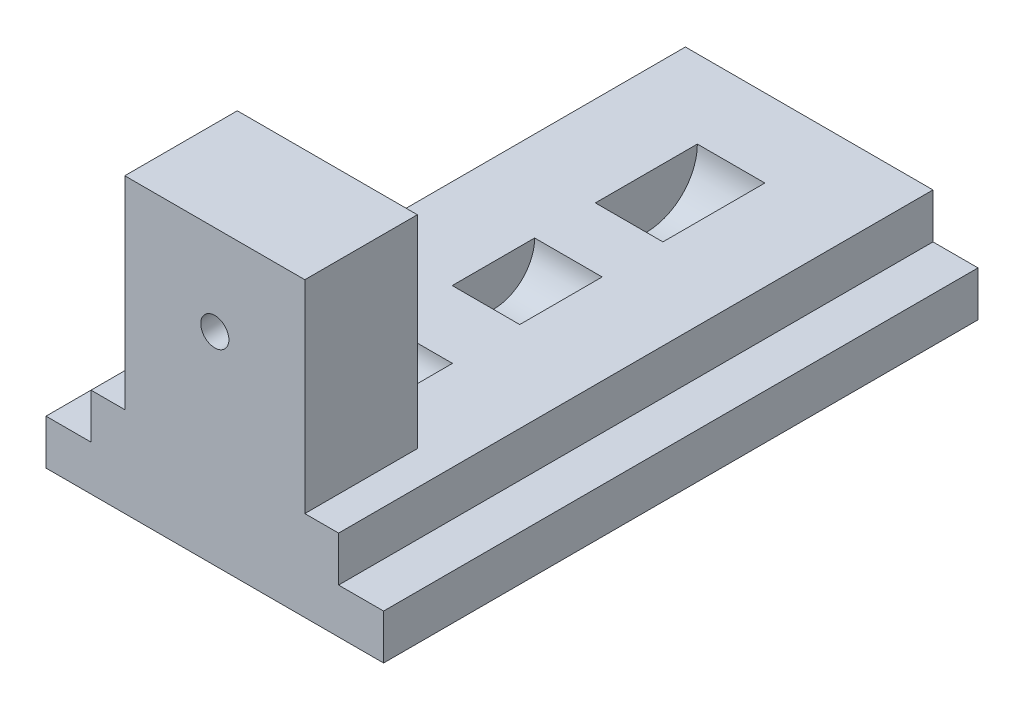
ISO-10303-21;
HEADER;
FILE_DESCRIPTION(('STEP AP214'),'2;1');
FILE_NAME('part.step','',(''),(''),'','','');
FILE_SCHEMA(('AUTOMOTIVE_DESIGN { 1 0 10303 214 1 1 1 1 }'));
ENDSEC;
DATA;
#1=APPLICATION_CONTEXT('core data for automotive mechanical design processes');
#2=APPLICATION_PROTOCOL_DEFINITION('international standard','automotive_design',2000,#1);
#3=PRODUCT_CONTEXT('',#1,'mechanical');
#4=PRODUCT('Part','Part','',(#3));
#5=PRODUCT_RELATED_PRODUCT_CATEGORY('part','',(#4));
#6=PRODUCT_DEFINITION_FORMATION('','',#4);
#7=PRODUCT_DEFINITION_CONTEXT('part definition',#1,'design');
#8=PRODUCT_DEFINITION('design','',#6,#7);
#9=PRODUCT_DEFINITION_SHAPE('','',#8);
#10=(LENGTH_UNIT() NAMED_UNIT(*) SI_UNIT(.MILLI.,.METRE.));
#11=(NAMED_UNIT(*) PLANE_ANGLE_UNIT() SI_UNIT($,.RADIAN.));
#12=(NAMED_UNIT(*) SI_UNIT($,.STERADIAN.) SOLID_ANGLE_UNIT());
#13=UNCERTAINTY_MEASURE_WITH_UNIT(LENGTH_MEASURE(1.E-05),#10,'distance_accuracy_value','');
#14=(GEOMETRIC_REPRESENTATION_CONTEXT(3) GLOBAL_UNCERTAINTY_ASSIGNED_CONTEXT((#13)) GLOBAL_UNIT_ASSIGNED_CONTEXT((#10,
#11,#12)) REPRESENTATION_CONTEXT('',''));
#15=CARTESIAN_POINT('',(0.,0.,0.));
#16=DIRECTION('',(0.,0.,1.));
#17=DIRECTION('',(1.,0.,0.));
#18=AXIS2_PLACEMENT_3D('',#15,#16,#17);
#19=CARTESIAN_POINT('',(6.,8.,-11.9518072289156));
#20=DIRECTION('',(0.,-1.,0.));
#21=DIRECTION('',(0.,0.,-1.));
#22=AXIS2_PLACEMENT_3D('',#19,#20,#21);
#23=PLANE('',#22);
#24=DIRECTION('',(-1.,0.,0.));
#25=VECTOR('',#24,1.);
#26=CARTESIAN_POINT('',(6.,7.99999999999996,-36.8192771084335));
#27=LINE('',#26,#25);
#28=CARTESIAN_POINT('',(6.,7.99999999999996,-36.8192771084335));
#29=VERTEX_POINT('',#28);
#30=CARTESIAN_POINT('',(0.,7.99999999999996,-36.8192771084335));
#31=VERTEX_POINT('',#30);
#32=EDGE_CURVE('E277',#29,#31,#27,.T.);
#33=ORIENTED_EDGE('',*,*,#32,.T.);
#34=DIRECTION('',(0.,0.,1.));
#35=VECTOR('',#34,1.);
#36=CARTESIAN_POINT('',(0.,8.,-67.2414822102894));
#37=LINE('',#36,#35);
#38=CARTESIAN_POINT('',(0.,8.,-45.8795180722889));
#39=VERTEX_POINT('',#38);
#40=EDGE_CURVE('E213',#39,#31,#37,.T.);
#41=ORIENTED_EDGE('',*,*,#40,.F.);
#42=DIRECTION('',(-1.,0.,0.));
#43=VECTOR('',#42,1.);
#44=CARTESIAN_POINT('',(6.,7.99999999999996,-45.8795180722889));
#45=LINE('',#44,#43);
#46=CARTESIAN_POINT('',(6.,7.99999999999996,-45.8795180722889));
#47=VERTEX_POINT('',#46);
#48=EDGE_CURVE('E280',#47,#39,#45,.T.);
#49=ORIENTED_EDGE('',*,*,#48,.F.);
#50=DIRECTION('',(0.,0.,1.));
#51=VECTOR('',#50,1.);
#52=CARTESIAN_POINT('',(6.,8.,-67.2414822102894));
#53=LINE('',#52,#51);
#54=EDGE_CURVE('E220',#47,#29,#53,.T.);
#55=ORIENTED_EDGE('',*,*,#54,.T.);
#56=EDGE_LOOP('',(#33,#41,#49,#55));
#57=FACE_BOUND('',#56,.T.);
#58=CARTESIAN_POINT('',(0.,8.,-31.4216867469878));
#59=VERTEX_POINT('',#58);
#60=CARTESIAN_POINT('',(0.,8.,-24.0963855421685));
#61=VERTEX_POINT('',#60);
#62=EDGE_CURVE('E215',#59,#61,#37,.T.);
#63=ORIENTED_EDGE('',*,*,#62,.F.);
#64=DIRECTION('',(-1.,0.,0.));
#65=VECTOR('',#64,1.);
#66=CARTESIAN_POINT('',(6.,7.99999999999999,-31.4216867469878));
#67=LINE('',#66,#65);
#68=CARTESIAN_POINT('',(6.,7.99999999999999,-31.4216867469878));
#69=VERTEX_POINT('',#68);
#70=EDGE_CURVE('E274',#69,#59,#67,.T.);
#71=ORIENTED_EDGE('',*,*,#70,.F.);
#72=CARTESIAN_POINT('',(6.,8.,-24.0963855421685));
#73=VERTEX_POINT('',#72);
#74=EDGE_CURVE('E236',#69,#73,#53,.T.);
#75=ORIENTED_EDGE('',*,*,#74,.T.);
#76=DIRECTION('',(-1.,0.,0.));
#77=VECTOR('',#76,1.);
#78=CARTESIAN_POINT('',(6.,8.,-24.0963855421685));
#79=LINE('',#78,#77);
#80=EDGE_CURVE('E271',#73,#61,#79,.T.);
#81=ORIENTED_EDGE('',*,*,#80,.T.);
#82=EDGE_LOOP('',(#63,#71,#75,#81));
#83=FACE_BOUND('',#82,.T.);
#84=CARTESIAN_POINT('',(0.,8.,-18.1204819277107));
#85=VERTEX_POINT('',#84);
#86=CARTESIAN_POINT('',(0.,8.,-11.9518072289156));
#87=VERTEX_POINT('',#86);
#88=EDGE_CURVE('E203',#85,#87,#37,.T.);
#89=ORIENTED_EDGE('',*,*,#88,.F.);
#90=DIRECTION('',(-1.,0.,0.));
#91=VECTOR('',#90,1.);
#92=CARTESIAN_POINT('',(6.,8.,-18.1204819277107));
#93=LINE('',#92,#91);
#94=CARTESIAN_POINT('',(6.,8.,-18.1204819277107));
#95=VERTEX_POINT('',#94);
#96=EDGE_CURVE('E268',#95,#85,#93,.T.);
#97=ORIENTED_EDGE('',*,*,#96,.F.);
#98=CARTESIAN_POINT('',(6.,8.,-11.9518072289156));
#99=VERTEX_POINT('',#98);
#100=EDGE_CURVE('E233',#95,#99,#53,.T.);
#101=ORIENTED_EDGE('',*,*,#100,.T.);
#102=DIRECTION('',(-1.,0.,0.));
#103=VECTOR('',#102,1.);
#104=CARTESIAN_POINT('',(6.,8.00000000000001,-11.9518072289156));
#105=LINE('',#104,#103);
#106=EDGE_CURVE('E265',#99,#87,#105,.T.);
#107=ORIENTED_EDGE('',*,*,#106,.T.);
#108=EDGE_LOOP('',(#89,#97,#101,#107));
#109=FACE_BOUND('',#108,.T.);
#110=DIRECTION('',(0.,0.,-1.));
#111=VECTOR('',#110,1.);
#112=CARTESIAN_POINT('',(11.,8.,-10.));
#113=LINE('',#112,#111);
#114=CARTESIAN_POINT('',(11.,8.,0.));
#115=VERTEX_POINT('',#114);
#116=CARTESIAN_POINT('',(11.,8.,-10.));
#117=VERTEX_POINT('',#116);
#118=EDGE_CURVE('E551',#115,#117,#113,.T.);
#119=ORIENTED_EDGE('',*,*,#118,.F.);
#120=DIRECTION('',(-1.,0.,0.));
#121=VECTOR('',#120,1.);
#122=CARTESIAN_POINT('',(6.,8.,0.));
#123=LINE('',#122,#121);
#124=CARTESIAN_POINT('',(14.,8.,0.));
#125=VERTEX_POINT('',#124);
#126=EDGE_CURVE('E179',#125,#115,#123,.T.);
#127=ORIENTED_EDGE('',*,*,#126,.F.);
#128=DIRECTION('',(0.,0.,1.));
#129=VECTOR('',#128,1.);
#130=CARTESIAN_POINT('',(14.,8.,-67.2414822102894));
#131=LINE('',#130,#129);
#132=CARTESIAN_POINT('',(14.,8.,-52.8192771084334));
#133=VERTEX_POINT('',#132);
#134=EDGE_CURVE('E237',#133,#125,#131,.T.);
#135=ORIENTED_EDGE('',*,*,#134,.F.);
#136=DIRECTION('',(-1.,0.,0.));
#137=VECTOR('',#136,1.);
#138=CARTESIAN_POINT('',(6.,7.99999999999996,-52.8192771084334));
#139=LINE('',#138,#137);
#140=CARTESIAN_POINT('',(-8.,8.,-52.8192771084334));
#141=VERTEX_POINT('',#140);
#142=EDGE_CURVE('E283',#133,#141,#139,.T.);
#143=ORIENTED_EDGE('',*,*,#142,.T.);
#144=DIRECTION('',(0.,0.,1.));
#145=VECTOR('',#144,1.);
#146=CARTESIAN_POINT('',(-8.,8.,-67.2414822102894));
#147=LINE('',#146,#145);
#148=CARTESIAN_POINT('',(-8.,8.,0.));
#149=VERTEX_POINT('',#148);
#150=EDGE_CURVE('E210',#141,#149,#147,.T.);
#151=ORIENTED_EDGE('',*,*,#150,.T.);
#152=CARTESIAN_POINT('',(-4.99999999999999,8.,0.));
#153=VERTEX_POINT('',#152);
#154=EDGE_CURVE('E256',#153,#149,#123,.T.);
#155=ORIENTED_EDGE('',*,*,#154,.F.);
#156=DIRECTION('',(0.,0.,1.));
#157=VECTOR('',#156,1.);
#158=CARTESIAN_POINT('',(-4.99999999999999,8.,0.));
#159=LINE('',#158,#157);
#160=CARTESIAN_POINT('',(-5.,8.,-10.));
#161=VERTEX_POINT('',#160);
#162=EDGE_CURVE('E55',#161,#153,#159,.T.);
#163=ORIENTED_EDGE('',*,*,#162,.F.);
#164=DIRECTION('',(-1.,0.,0.));
#165=VECTOR('',#164,1.);
#166=CARTESIAN_POINT('',(-5.,8.,-10.));
#167=LINE('',#166,#165);
#168=EDGE_CURVE('E50',#117,#161,#167,.T.);
#169=ORIENTED_EDGE('',*,*,#168,.F.);
#170=EDGE_LOOP('',(#119,#127,#135,#143,#151,#155,#163,#169));
#171=FACE_BOUND('',#170,.T.);
#172=ADVANCED_FACE('F35',(#57,#83,#109,#171),#23,.F.);
#173=CARTESIAN_POINT('',(6.,8.,0.));
#174=DIRECTION('',(0.,0.,-1.));
#175=DIRECTION('',(-1.,0.,0.));
#176=AXIS2_PLACEMENT_3D('',#173,#174,#175);
#177=PLANE('',#176);
#178=CARTESIAN_POINT('',(3.00000000000001,18.,0.));
#179=DIRECTION('',(0.,0.,1.));
#180=DIRECTION('',(1.,0.,0.));
#181=AXIS2_PLACEMENT_3D('',#178,#179,#180);
#182=CIRCLE('',#181,1.25);
#183=CARTESIAN_POINT('',(4.25000000000001,18.,0.));
#184=VERTEX_POINT('',#183);
#185=EDGE_CURVE('E549',#184,#184,#182,.T.);
#186=ORIENTED_EDGE('',*,*,#185,.F.);
#187=EDGE_LOOP('',(#186));
#188=FACE_BOUND('',#187,.T.);
#189=ORIENTED_EDGE('',*,*,#126,.T.);
#190=DIRECTION('',(0.,-1.,0.));
#191=VECTOR('',#190,1.);
#192=CARTESIAN_POINT('',(11.,26.,0.));
#193=LINE('',#192,#191);
#194=CARTESIAN_POINT('',(11.,26.,0.));
#195=VERTEX_POINT('',#194);
#196=EDGE_CURVE('E161',#195,#115,#193,.T.);
#197=ORIENTED_EDGE('',*,*,#196,.F.);
#198=DIRECTION('',(1.,0.,0.));
#199=VECTOR('',#198,1.);
#200=CARTESIAN_POINT('',(11.,26.,0.));
#201=LINE('',#200,#199);
#202=CARTESIAN_POINT('',(-4.99999999999999,26.,0.));
#203=VERTEX_POINT('',#202);
#204=EDGE_CURVE('E167',#203,#195,#201,.T.);
#205=ORIENTED_EDGE('',*,*,#204,.F.);
#206=DIRECTION('',(0.,-1.,0.));
#207=VECTOR('',#206,1.);
#208=CARTESIAN_POINT('',(-4.99999999999999,26.,0.));
#209=LINE('',#208,#207);
#210=EDGE_CURVE('E556',#203,#153,#209,.T.);
#211=ORIENTED_EDGE('',*,*,#210,.T.);
#212=ORIENTED_EDGE('',*,*,#154,.T.);
#213=DIRECTION('',(0.,-1.,0.));
#214=VECTOR('',#213,1.);
#215=CARTESIAN_POINT('',(-8.,8.,0.));
#216=LINE('',#215,#214);
#217=CARTESIAN_POINT('',(-8.,4.,0.));
#218=VERTEX_POINT('',#217);
#219=EDGE_CURVE('E180',#149,#218,#216,.T.);
#220=ORIENTED_EDGE('',*,*,#219,.T.);
#221=DIRECTION('',(-1.,0.,0.));
#222=VECTOR('',#221,1.);
#223=CARTESIAN_POINT('',(-8.,4.,0.));
#224=LINE('',#223,#222);
#225=CARTESIAN_POINT('',(-12.,4.,0.));
#226=VERTEX_POINT('',#225);
#227=EDGE_CURVE('E183',#218,#226,#224,.T.);
#228=ORIENTED_EDGE('',*,*,#227,.T.);
#229=DIRECTION('',(0.,-1.,0.));
#230=VECTOR('',#229,1.);
#231=CARTESIAN_POINT('',(-12.,4.,0.));
#232=LINE('',#231,#230);
#233=CARTESIAN_POINT('',(-12.,0.,0.));
#234=VERTEX_POINT('',#233);
#235=EDGE_CURVE('E200',#226,#234,#232,.T.);
#236=ORIENTED_EDGE('',*,*,#235,.T.);
#237=DIRECTION('',(-1.,0.,0.));
#238=VECTOR('',#237,1.);
#239=CARTESIAN_POINT('',(6.,0.,0.));
#240=LINE('',#239,#238);
#241=CARTESIAN_POINT('',(18.,0.,0.));
#242=VERTEX_POINT('',#241);
#243=EDGE_CURVE('E11',#242,#234,#240,.T.);
#244=ORIENTED_EDGE('',*,*,#243,.F.);
#245=DIRECTION('',(0.,1.,0.));
#246=VECTOR('',#245,1.);
#247=CARTESIAN_POINT('',(18.,4.,0.));
#248=LINE('',#247,#246);
#249=CARTESIAN_POINT('',(18.,4.,0.));
#250=VERTEX_POINT('',#249);
#251=EDGE_CURVE('E196',#242,#250,#248,.T.);
#252=ORIENTED_EDGE('',*,*,#251,.T.);
#253=DIRECTION('',(-1.,0.,0.));
#254=VECTOR('',#253,1.);
#255=CARTESIAN_POINT('',(14.,4.,0.));
#256=LINE('',#255,#254);
#257=CARTESIAN_POINT('',(14.,4.,0.));
#258=VERTEX_POINT('',#257);
#259=EDGE_CURVE('E227',#250,#258,#256,.T.);
#260=ORIENTED_EDGE('',*,*,#259,.T.);
#261=DIRECTION('',(0.,1.,0.));
#262=VECTOR('',#261,1.);
#263=CARTESIAN_POINT('',(14.,8.,0.));
#264=LINE('',#263,#262);
#265=EDGE_CURVE('E230',#258,#125,#264,.T.);
#266=ORIENTED_EDGE('',*,*,#265,.T.);
#267=EDGE_LOOP('',(#189,#197,#205,#211,#212,#220,#228,#236,#244,#252,#260,#266));
#268=FACE_BOUND('',#267,.T.);
#269=ADVANCED_FACE('F37',(#188,#268),#177,.F.);
#270=CARTESIAN_POINT('',(6.,0.,0.));
#271=DIRECTION('',(0.,1.,0.));
#272=DIRECTION('',(0.,0.,1.));
#273=AXIS2_PLACEMENT_3D('',#270,#271,#272);
#274=PLANE('',#273);
#275=ORIENTED_EDGE('',*,*,#243,.T.);
#276=DIRECTION('',(0.,0.,1.));
#277=VECTOR('',#276,1.);
#278=CARTESIAN_POINT('',(-12.,0.,-67.2414822102894));
#279=LINE('',#278,#277);
#280=CARTESIAN_POINT('',(-12.,0.,-52.8192771084334));
#281=VERTEX_POINT('',#280);
#282=EDGE_CURVE('E193',#281,#234,#279,.T.);
#283=ORIENTED_EDGE('',*,*,#282,.F.);
#284=DIRECTION('',(-1.,0.,0.));
#285=VECTOR('',#284,1.);
#286=CARTESIAN_POINT('',(6.,0.,-52.8192771084334));
#287=LINE('',#286,#285);
#288=CARTESIAN_POINT('',(18.,0.,-52.8192771084334));
#289=VERTEX_POINT('',#288);
#290=EDGE_CURVE('E43',#289,#281,#287,.T.);
#291=ORIENTED_EDGE('',*,*,#290,.F.);
#292=DIRECTION('',(0.,0.,1.));
#293=VECTOR('',#292,1.);
#294=CARTESIAN_POINT('',(18.,0.,-67.2414822102894));
#295=LINE('',#294,#293);
#296=EDGE_CURVE('E232',#289,#242,#295,.T.);
#297=ORIENTED_EDGE('',*,*,#296,.T.);
#298=EDGE_LOOP('',(#275,#283,#291,#297));
#299=FACE_BOUND('',#298,.T.);
#300=ADVANCED_FACE('F296',(#299),#274,.F.);
#301=CARTESIAN_POINT('',(6.,0.,-52.8192771084334));
#302=DIRECTION('',(0.,0.,1.));
#303=DIRECTION('',(1.,0.,0.));
#304=AXIS2_PLACEMENT_3D('',#301,#302,#303);
#305=PLANE('',#304);
#306=ORIENTED_EDGE('',*,*,#290,.T.);
#307=DIRECTION('',(0.,1.,0.));
#308=VECTOR('',#307,1.);
#309=CARTESIAN_POINT('',(-12.,4.,-52.8192771084334));
#310=LINE('',#309,#308);
#311=CARTESIAN_POINT('',(-12.,4.,-52.8192771084334));
#312=VERTEX_POINT('',#311);
#313=EDGE_CURVE('E195',#281,#312,#310,.T.);
#314=ORIENTED_EDGE('',*,*,#313,.T.);
#315=DIRECTION('',(1.,0.,0.));
#316=VECTOR('',#315,1.);
#317=CARTESIAN_POINT('',(-8.,4.,-52.8192771084334));
#318=LINE('',#317,#316);
#319=CARTESIAN_POINT('',(-8.,4.,-52.8192771084334));
#320=VERTEX_POINT('',#319);
#321=EDGE_CURVE('E192',#312,#320,#318,.T.);
#322=ORIENTED_EDGE('',*,*,#321,.T.);
#323=DIRECTION('',(0.,1.,0.));
#324=VECTOR('',#323,1.);
#325=CARTESIAN_POINT('',(-8.,8.,-52.8192771084334));
#326=LINE('',#325,#324);
#327=EDGE_CURVE('E189',#320,#141,#326,.T.);
#328=ORIENTED_EDGE('',*,*,#327,.T.);
#329=ORIENTED_EDGE('',*,*,#142,.F.);
#330=DIRECTION('',(0.,-1.,0.));
#331=VECTOR('',#330,1.);
#332=CARTESIAN_POINT('',(14.,8.,-52.8192771084334));
#333=LINE('',#332,#331);
#334=CARTESIAN_POINT('',(14.,4.,-52.8192771084334));
#335=VERTEX_POINT('',#334);
#336=EDGE_CURVE('E222',#133,#335,#333,.T.);
#337=ORIENTED_EDGE('',*,*,#336,.T.);
#338=DIRECTION('',(1.,0.,0.));
#339=VECTOR('',#338,1.);
#340=CARTESIAN_POINT('',(14.,4.,-52.8192771084334));
#341=LINE('',#340,#339);
#342=CARTESIAN_POINT('',(18.,4.,-52.8192771084334));
#343=VERTEX_POINT('',#342);
#344=EDGE_CURVE('E219',#335,#343,#341,.T.);
#345=ORIENTED_EDGE('',*,*,#344,.T.);
#346=DIRECTION('',(0.,-1.,0.));
#347=VECTOR('',#346,1.);
#348=CARTESIAN_POINT('',(18.,4.,-52.8192771084334));
#349=LINE('',#348,#347);
#350=EDGE_CURVE('E216',#343,#289,#349,.T.);
#351=ORIENTED_EDGE('',*,*,#350,.T.);
#352=EDGE_LOOP('',(#306,#314,#322,#328,#329,#337,#345,#351));
#353=FACE_BOUND('',#352,.T.);
#354=ADVANCED_FACE('F286',(#353),#305,.F.);
#355=CARTESIAN_POINT('',(6.,7.99999999999996,-41.3493975903612));
#356=DIRECTION('',(-1.,0.,0.));
#357=DIRECTION('',(0.,0.,1.));
#358=AXIS2_PLACEMENT_3D('',#355,#356,#357);
#359=CYLINDRICAL_SURFACE('',#358,4.53012048192768);
#360=CARTESIAN_POINT('',(0.,7.99999999999996,-41.3493975903612));
#361=DIRECTION('',(-1.,0.,0.));
#362=DIRECTION('',(0.,0.,1.));
#363=AXIS2_PLACEMENT_3D('',#360,#361,#362);
#364=CIRCLE('',#363,4.53012048192768);
#365=EDGE_CURVE('E224',#39,#31,#364,.T.);
#366=ORIENTED_EDGE('',*,*,#365,.T.);
#367=ORIENTED_EDGE('',*,*,#32,.F.);
#368=CARTESIAN_POINT('',(6.,7.99999999999996,-41.3493975903612));
#369=DIRECTION('',(-1.,0.,0.));
#370=DIRECTION('',(0.,0.,1.));
#371=AXIS2_PLACEMENT_3D('',#368,#369,#370);
#372=CIRCLE('',#371,4.53012048192768);
#373=EDGE_CURVE('E246',#47,#29,#372,.T.);
#374=ORIENTED_EDGE('',*,*,#373,.F.);
#375=ORIENTED_EDGE('',*,*,#48,.T.);
#376=EDGE_LOOP('',(#366,#367,#374,#375));
#377=FACE_BOUND('',#376,.T.);
#378=ADVANCED_FACE('F350',(#377),#359,.F.);
#379=CARTESIAN_POINT('',(6.,8.,-27.7590361445782));
#380=DIRECTION('',(-1.,0.,0.));
#381=DIRECTION('',(0.,0.,1.));
#382=AXIS2_PLACEMENT_3D('',#379,#380,#381);
#383=CYLINDRICAL_SURFACE('',#382,3.66265060240963);
#384=CARTESIAN_POINT('',(0.,8.,-27.7590361445782));
#385=DIRECTION('',(-1.,0.,0.));
#386=DIRECTION('',(0.,0.,1.));
#387=AXIS2_PLACEMENT_3D('',#384,#385,#386);
#388=CIRCLE('',#387,3.66265060240963);
#389=EDGE_CURVE('E259',#59,#61,#388,.T.);
#390=ORIENTED_EDGE('',*,*,#389,.T.);
#391=ORIENTED_EDGE('',*,*,#80,.F.);
#392=CARTESIAN_POINT('',(6.,8.,-27.7590361445782));
#393=DIRECTION('',(-1.,0.,0.));
#394=DIRECTION('',(0.,0.,1.));
#395=AXIS2_PLACEMENT_3D('',#392,#393,#394);
#396=CIRCLE('',#395,3.66265060240963);
#397=EDGE_CURVE('E249',#69,#73,#396,.T.);
#398=ORIENTED_EDGE('',*,*,#397,.F.);
#399=ORIENTED_EDGE('',*,*,#70,.T.);
#400=EDGE_LOOP('',(#390,#391,#398,#399));
#401=FACE_BOUND('',#400,.T.);
#402=ADVANCED_FACE('F346',(#401),#383,.F.);
#403=CARTESIAN_POINT('',(6.,8.00000000000001,-15.0361445783132));
#404=DIRECTION('',(-1.,0.,0.));
#405=DIRECTION('',(0.,0.,1.));
#406=AXIS2_PLACEMENT_3D('',#403,#404,#405);
#407=CYLINDRICAL_SURFACE('',#406,3.08433734939756);
#408=CARTESIAN_POINT('',(0.,8.00000000000001,-15.0361445783132));
#409=DIRECTION('',(-1.,0.,0.));
#410=DIRECTION('',(0.,0.,1.));
#411=AXIS2_PLACEMENT_3D('',#408,#409,#410);
#412=CIRCLE('',#411,3.08433734939756);
#413=EDGE_CURVE('E250',#85,#87,#412,.T.);
#414=ORIENTED_EDGE('',*,*,#413,.T.);
#415=ORIENTED_EDGE('',*,*,#106,.F.);
#416=CARTESIAN_POINT('',(6.,8.00000000000001,-15.0361445783132));
#417=DIRECTION('',(-1.,0.,0.));
#418=DIRECTION('',(0.,0.,1.));
#419=AXIS2_PLACEMENT_3D('',#416,#417,#418);
#420=CIRCLE('',#419,3.08433734939756);
#421=EDGE_CURVE('E253',#95,#99,#420,.T.);
#422=ORIENTED_EDGE('',*,*,#421,.F.);
#423=ORIENTED_EDGE('',*,*,#96,.T.);
#424=EDGE_LOOP('',(#414,#415,#422,#423));
#425=FACE_BOUND('',#424,.T.);
#426=ADVANCED_FACE('F343',(#425),#407,.F.);
#427=CARTESIAN_POINT('',(6.,0.,-67.2414822102894));
#428=DIRECTION('',(-1.,0.,0.));
#429=DIRECTION('',(0.,-1.,0.));
#430=AXIS2_PLACEMENT_3D('',#427,#428,#429);
#431=PLANE('',#430);
#432=ORIENTED_EDGE('',*,*,#54,.F.);
#433=ORIENTED_EDGE('',*,*,#373,.T.);
#434=EDGE_LOOP('',(#432,#433));
#435=FACE_BOUND('',#434,.T.);
#436=ADVANCED_FACE('F342',(#435),#431,.T.);
#437=ORIENTED_EDGE('',*,*,#74,.F.);
#438=ORIENTED_EDGE('',*,*,#397,.T.);
#439=EDGE_LOOP('',(#437,#438));
#440=FACE_BOUND('',#439,.T.);
#441=ADVANCED_FACE('F384',(#440),#431,.T.);
#442=ORIENTED_EDGE('',*,*,#100,.F.);
#443=ORIENTED_EDGE('',*,*,#421,.T.);
#444=EDGE_LOOP('',(#442,#443));
#445=FACE_BOUND('',#444,.T.);
#446=ADVANCED_FACE('F386',(#445),#431,.T.);
#447=CARTESIAN_POINT('',(14.,8.,-67.2414822102894));
#448=DIRECTION('',(1.,0.,0.));
#449=DIRECTION('',(0.,0.,-1.));
#450=AXIS2_PLACEMENT_3D('',#447,#448,#449);
#451=PLANE('',#450);
#452=ORIENTED_EDGE('',*,*,#336,.F.);
#453=ORIENTED_EDGE('',*,*,#134,.T.);
#454=ORIENTED_EDGE('',*,*,#265,.F.);
#455=DIRECTION('',(0.,0.,1.));
#456=VECTOR('',#455,1.);
#457=CARTESIAN_POINT('',(14.,4.,-67.2414822102894));
#458=LINE('',#457,#456);
#459=EDGE_CURVE('E240',#335,#258,#458,.T.);
#460=ORIENTED_EDGE('',*,*,#459,.F.);
#461=EDGE_LOOP('',(#452,#453,#454,#460));
#462=FACE_BOUND('',#461,.T.);
#463=ADVANCED_FACE('F312',(#462),#451,.T.);
#464=CARTESIAN_POINT('',(14.,4.,-67.2414822102894));
#465=DIRECTION('',(0.,1.,0.));
#466=DIRECTION('',(0.,0.,1.));
#467=AXIS2_PLACEMENT_3D('',#464,#465,#466);
#468=PLANE('',#467);
#469=ORIENTED_EDGE('',*,*,#344,.F.);
#470=ORIENTED_EDGE('',*,*,#459,.T.);
#471=ORIENTED_EDGE('',*,*,#259,.F.);
#472=DIRECTION('',(0.,0.,1.));
#473=VECTOR('',#472,1.);
#474=CARTESIAN_POINT('',(18.,4.,-67.2414822102894));
#475=LINE('',#474,#473);
#476=EDGE_CURVE('E242',#343,#250,#475,.T.);
#477=ORIENTED_EDGE('',*,*,#476,.F.);
#478=EDGE_LOOP('',(#469,#470,#471,#477));
#479=FACE_BOUND('',#478,.T.);
#480=ADVANCED_FACE('F316',(#479),#468,.T.);
#481=CARTESIAN_POINT('',(18.,4.,-67.2414822102894));
#482=DIRECTION('',(1.,0.,0.));
#483=DIRECTION('',(0.,0.,-1.));
#484=AXIS2_PLACEMENT_3D('',#481,#482,#483);
#485=PLANE('',#484);
#486=ORIENTED_EDGE('',*,*,#350,.F.);
#487=ORIENTED_EDGE('',*,*,#476,.T.);
#488=ORIENTED_EDGE('',*,*,#251,.F.);
#489=ORIENTED_EDGE('',*,*,#296,.F.);
#490=EDGE_LOOP('',(#486,#487,#488,#489));
#491=FACE_BOUND('',#490,.T.);
#492=ADVANCED_FACE('F319',(#491),#485,.T.);
#493=CARTESIAN_POINT('',(0.,0.,-67.2414822102894));
#494=DIRECTION('',(1.,0.,0.));
#495=DIRECTION('',(0.,0.,-1.));
#496=AXIS2_PLACEMENT_3D('',#493,#494,#495);
#497=PLANE('',#496);
#498=ORIENTED_EDGE('',*,*,#413,.F.);
#499=ORIENTED_EDGE('',*,*,#88,.T.);
#500=EDGE_LOOP('',(#498,#499));
#501=FACE_BOUND('',#500,.T.);
#502=ADVANCED_FACE('F321',(#501),#497,.T.);
#503=ORIENTED_EDGE('',*,*,#389,.F.);
#504=ORIENTED_EDGE('',*,*,#62,.T.);
#505=EDGE_LOOP('',(#503,#504));
#506=FACE_BOUND('',#505,.T.);
#507=ADVANCED_FACE('F327',(#506),#497,.T.);
#508=ORIENTED_EDGE('',*,*,#365,.F.);
#509=ORIENTED_EDGE('',*,*,#40,.T.);
#510=EDGE_LOOP('',(#508,#509));
#511=FACE_BOUND('',#510,.T.);
#512=ADVANCED_FACE('F330',(#511),#497,.T.);
#513=CARTESIAN_POINT('',(-12.,4.,-67.2414822102894));
#514=DIRECTION('',(-1.,0.,0.));
#515=DIRECTION('',(0.,0.,1.));
#516=AXIS2_PLACEMENT_3D('',#513,#514,#515);
#517=PLANE('',#516);
#518=ORIENTED_EDGE('',*,*,#313,.F.);
#519=ORIENTED_EDGE('',*,*,#282,.T.);
#520=ORIENTED_EDGE('',*,*,#235,.F.);
#521=DIRECTION('',(0.,0.,1.));
#522=VECTOR('',#521,1.);
#523=CARTESIAN_POINT('',(-12.,4.,-67.2414822102894));
#524=LINE('',#523,#522);
#525=EDGE_CURVE('E206',#312,#226,#524,.T.);
#526=ORIENTED_EDGE('',*,*,#525,.F.);
#527=EDGE_LOOP('',(#518,#519,#520,#526));
#528=FACE_BOUND('',#527,.T.);
#529=ADVANCED_FACE('F294',(#528),#517,.T.);
#530=CARTESIAN_POINT('',(-8.,4.,-67.2414822102894));
#531=DIRECTION('',(0.,1.,0.));
#532=DIRECTION('',(-1.,0.,0.));
#533=AXIS2_PLACEMENT_3D('',#530,#531,#532);
#534=PLANE('',#533);
#535=ORIENTED_EDGE('',*,*,#321,.F.);
#536=ORIENTED_EDGE('',*,*,#525,.T.);
#537=ORIENTED_EDGE('',*,*,#227,.F.);
#538=DIRECTION('',(0.,0.,1.));
#539=VECTOR('',#538,1.);
#540=CARTESIAN_POINT('',(-8.,4.,-67.2414822102894));
#541=LINE('',#540,#539);
#542=EDGE_CURVE('E208',#320,#218,#541,.T.);
#543=ORIENTED_EDGE('',*,*,#542,.F.);
#544=EDGE_LOOP('',(#535,#536,#537,#543));
#545=FACE_BOUND('',#544,.T.);
#546=ADVANCED_FACE('F302',(#545),#534,.T.);
#547=CARTESIAN_POINT('',(-8.,8.,-67.2414822102894));
#548=DIRECTION('',(-1.,0.,0.));
#549=DIRECTION('',(0.,0.,1.));
#550=AXIS2_PLACEMENT_3D('',#547,#548,#549);
#551=PLANE('',#550);
#552=ORIENTED_EDGE('',*,*,#327,.F.);
#553=ORIENTED_EDGE('',*,*,#542,.T.);
#554=ORIENTED_EDGE('',*,*,#219,.F.);
#555=ORIENTED_EDGE('',*,*,#150,.F.);
#556=EDGE_LOOP('',(#552,#553,#554,#555));
#557=FACE_BOUND('',#556,.T.);
#558=ADVANCED_FACE('F306',(#557),#551,.T.);
#559=CARTESIAN_POINT('',(11.,26.,-10.));
#560=DIRECTION('',(-1.,0.,0.));
#561=DIRECTION('',(0.,0.,1.));
#562=AXIS2_PLACEMENT_3D('',#559,#560,#561);
#563=PLANE('',#562);
#564=ORIENTED_EDGE('',*,*,#118,.T.);
#565=DIRECTION('',(0.,-1.,0.));
#566=VECTOR('',#565,1.);
#567=CARTESIAN_POINT('',(11.,26.,-10.));
#568=LINE('',#567,#566);
#569=CARTESIAN_POINT('',(11.,26.,-10.));
#570=VERTEX_POINT('',#569);
#571=EDGE_CURVE('E163',#570,#117,#568,.T.);
#572=ORIENTED_EDGE('',*,*,#571,.F.);
#573=DIRECTION('',(0.,0.,-1.));
#574=VECTOR('',#573,1.);
#575=CARTESIAN_POINT('',(11.,26.,-10.));
#576=LINE('',#575,#574);
#577=EDGE_CURVE('E157',#195,#570,#576,.T.);
#578=ORIENTED_EDGE('',*,*,#577,.F.);
#579=ORIENTED_EDGE('',*,*,#196,.T.);
#580=EDGE_LOOP('',(#564,#572,#578,#579));
#581=FACE_BOUND('',#580,.T.);
#582=ADVANCED_FACE('F159',(#581),#563,.F.);
#583=CARTESIAN_POINT('',(-5.,26.,-10.));
#584=DIRECTION('',(0.,0.,1.));
#585=DIRECTION('',(1.,0.,0.));
#586=AXIS2_PLACEMENT_3D('',#583,#584,#585);
#587=PLANE('',#586);
#588=CARTESIAN_POINT('',(3.00000000000001,18.,-10.));
#589=DIRECTION('',(0.,0.,1.));
#590=DIRECTION('',(1.,0.,0.));
#591=AXIS2_PLACEMENT_3D('',#588,#589,#590);
#592=CIRCLE('',#591,1.25);
#593=CARTESIAN_POINT('',(4.25000000000001,18.,-10.));
#594=VERTEX_POINT('',#593);
#595=EDGE_CURVE('E546',#594,#594,#592,.F.);
#596=ORIENTED_EDGE('',*,*,#595,.F.);
#597=EDGE_LOOP('',(#596));
#598=FACE_BOUND('',#597,.T.);
#599=ORIENTED_EDGE('',*,*,#168,.T.);
#600=DIRECTION('',(0.,-1.,0.));
#601=VECTOR('',#600,1.);
#602=CARTESIAN_POINT('',(-5.,26.,-10.));
#603=LINE('',#602,#601);
#604=CARTESIAN_POINT('',(-5.,26.,-10.));
#605=VERTEX_POINT('',#604);
#606=EDGE_CURVE('E185',#605,#161,#603,.T.);
#607=ORIENTED_EDGE('',*,*,#606,.F.);
#608=DIRECTION('',(-1.,0.,0.));
#609=VECTOR('',#608,1.);
#610=CARTESIAN_POINT('',(-5.,26.,-10.));
#611=LINE('',#610,#609);
#612=EDGE_CURVE('E166',#570,#605,#611,.T.);
#613=ORIENTED_EDGE('',*,*,#612,.F.);
#614=ORIENTED_EDGE('',*,*,#571,.T.);
#615=EDGE_LOOP('',(#599,#607,#613,#614));
#616=FACE_BOUND('',#615,.T.);
#617=ADVANCED_FACE('F501',(#598,#616),#587,.F.);
#618=CARTESIAN_POINT('',(-4.99999999999999,26.,0.));
#619=DIRECTION('',(1.,0.,0.));
#620=DIRECTION('',(0.,0.,-1.));
#621=AXIS2_PLACEMENT_3D('',#618,#619,#620);
#622=PLANE('',#621);
#623=ORIENTED_EDGE('',*,*,#162,.T.);
#624=ORIENTED_EDGE('',*,*,#210,.F.);
#625=DIRECTION('',(0.,0.,1.));
#626=VECTOR('',#625,1.);
#627=CARTESIAN_POINT('',(-4.99999999999999,26.,0.));
#628=LINE('',#627,#626);
#629=EDGE_CURVE('E172',#605,#203,#628,.T.);
#630=ORIENTED_EDGE('',*,*,#629,.F.);
#631=ORIENTED_EDGE('',*,*,#606,.T.);
#632=EDGE_LOOP('',(#623,#624,#630,#631));
#633=FACE_BOUND('',#632,.T.);
#634=ADVANCED_FACE('F508',(#633),#622,.F.);
#635=CARTESIAN_POINT('',(0.,26.,0.));
#636=DIRECTION('',(0.,-1.,0.));
#637=DIRECTION('',(0.,0.,-1.));
#638=AXIS2_PLACEMENT_3D('',#635,#636,#637);
#639=PLANE('',#638);
#640=ORIENTED_EDGE('',*,*,#204,.T.);
#641=ORIENTED_EDGE('',*,*,#577,.T.);
#642=ORIENTED_EDGE('',*,*,#612,.T.);
#643=ORIENTED_EDGE('',*,*,#629,.T.);
#644=EDGE_LOOP('',(#640,#641,#642,#643));
#645=FACE_BOUND('',#644,.T.);
#646=ADVANCED_FACE('F170',(#645),#639,.F.);
#647=CARTESIAN_POINT('',(3.00000000000001,18.,-13.5355339059327));
#648=DIRECTION('',(0.,0.,1.));
#649=DIRECTION('',(1.,0.,0.));
#650=AXIS2_PLACEMENT_3D('',#647,#648,#649);
#651=CYLINDRICAL_SURFACE('',#650,1.25);
#652=ORIENTED_EDGE('',*,*,#595,.T.);
#653=EDGE_LOOP('',(#652));
#654=FACE_BOUND('',#653,.T.);
#655=ORIENTED_EDGE('',*,*,#185,.T.);
#656=EDGE_LOOP('',(#655));
#657=FACE_BOUND('',#656,.T.);
#658=ADVANCED_FACE('F521',(#654,#657),#651,.F.);
#659=CLOSED_SHELL('',(#172,#269,#300,#354,#378,#402,#426,#436,#441,#446,#463,#480,#492,#502,
#507,#512,#529,#546,#558,#582,#617,#634,#646,#658));
#660=MANIFOLD_SOLID_BREP('B2',#659);
#661=ADVANCED_BREP_SHAPE_REPRESENTATION('',(#18,#660),#14);
#662=SHAPE_DEFINITION_REPRESENTATION(#9,#661);
ENDSEC;
END-ISO-10303-21;
